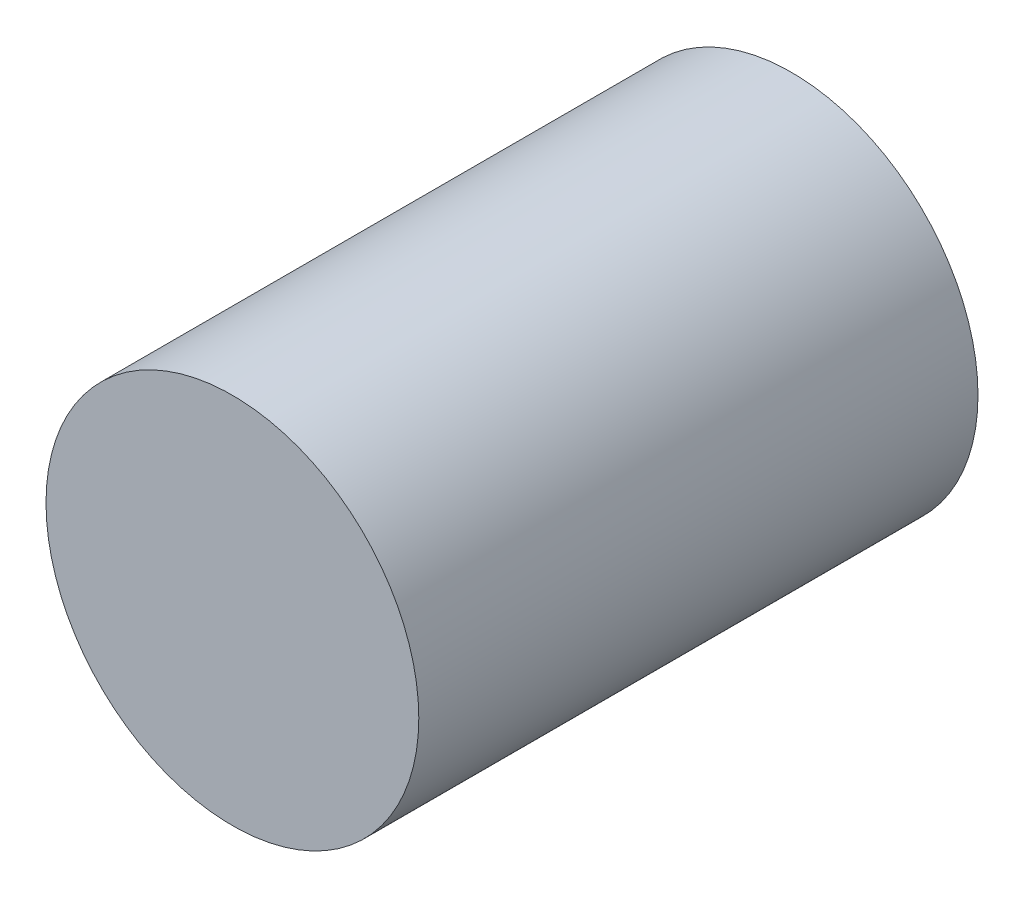
ISO-10303-21;
HEADER;
FILE_DESCRIPTION(('STEP AP214'),'2;1');
FILE_NAME('part.step','',(''),(''),'','','');
FILE_SCHEMA(('AUTOMOTIVE_DESIGN { 1 0 10303 214 1 1 1 1 }'));
ENDSEC;
DATA;
#1=APPLICATION_CONTEXT('core data for automotive mechanical design processes');
#2=APPLICATION_PROTOCOL_DEFINITION('international standard','automotive_design',2000,#1);
#3=PRODUCT_CONTEXT('',#1,'mechanical');
#4=PRODUCT('Part','Part','',(#3));
#5=PRODUCT_RELATED_PRODUCT_CATEGORY('part','',(#4));
#6=PRODUCT_DEFINITION_FORMATION('','',#4);
#7=PRODUCT_DEFINITION_CONTEXT('part definition',#1,'design');
#8=PRODUCT_DEFINITION('design','',#6,#7);
#9=PRODUCT_DEFINITION_SHAPE('','',#8);
#10=(LENGTH_UNIT() NAMED_UNIT(*) SI_UNIT(.MILLI.,.METRE.));
#11=(NAMED_UNIT(*) PLANE_ANGLE_UNIT() SI_UNIT($,.RADIAN.));
#12=(NAMED_UNIT(*) SI_UNIT($,.STERADIAN.) SOLID_ANGLE_UNIT());
#13=UNCERTAINTY_MEASURE_WITH_UNIT(LENGTH_MEASURE(1.E-05),#10,'distance_accuracy_value','');
#14=(GEOMETRIC_REPRESENTATION_CONTEXT(3) GLOBAL_UNCERTAINTY_ASSIGNED_CONTEXT((#13)) GLOBAL_UNIT_ASSIGNED_CONTEXT((#10,
#11,#12)) REPRESENTATION_CONTEXT('',''));
#15=CARTESIAN_POINT('',(0.,0.,0.));
#16=DIRECTION('',(0.,0.,1.));
#17=DIRECTION('',(1.,0.,0.));
#18=AXIS2_PLACEMENT_3D('',#15,#16,#17);
#19=CARTESIAN_POINT('',(0.,0.,30.));
#20=DIRECTION('',(0.,0.,-1.));
#21=DIRECTION('',(-1.,0.,0.));
#22=AXIS2_PLACEMENT_3D('',#19,#20,#21);
#23=CYLINDRICAL_SURFACE('',#22,10.);
#24=CARTESIAN_POINT('',(0.,0.,30.));
#25=DIRECTION('',(0.,0.,1.));
#26=DIRECTION('',(1.,0.,0.));
#27=AXIS2_PLACEMENT_3D('',#24,#25,#26);
#28=CIRCLE('',#27,10.);
#29=CARTESIAN_POINT('',(10.,0.,30.));
#30=VERTEX_POINT('',#29);
#31=EDGE_CURVE('E10',#30,#30,#28,.T.);
#32=ORIENTED_EDGE('',*,*,#31,.F.);
#33=EDGE_LOOP('',(#32));
#34=FACE_BOUND('',#33,.T.);
#35=CARTESIAN_POINT('',(0.,0.,0.));
#36=DIRECTION('',(0.,0.,1.));
#37=DIRECTION('',(1.,0.,0.));
#38=AXIS2_PLACEMENT_3D('',#35,#36,#37);
#39=CIRCLE('',#38,10.);
#40=CARTESIAN_POINT('',(10.,0.,0.));
#41=VERTEX_POINT('',#40);
#42=EDGE_CURVE('E40',#41,#41,#39,.T.);
#43=ORIENTED_EDGE('',*,*,#42,.T.);
#44=EDGE_LOOP('',(#43));
#45=FACE_BOUND('',#44,.T.);
#46=ADVANCED_FACE('F37',(#34,#45),#23,.T.);
#47=CARTESIAN_POINT('',(0.,0.,30.));
#48=DIRECTION('',(0.,0.,1.));
#49=DIRECTION('',(1.,0.,0.));
#50=AXIS2_PLACEMENT_3D('',#47,#48,#49);
#51=PLANE('',#50);
#52=ORIENTED_EDGE('',*,*,#31,.T.);
#53=EDGE_LOOP('',(#52));
#54=FACE_BOUND('',#53,.T.);
#55=ADVANCED_FACE('F52',(#54),#51,.T.);
#56=CARTESIAN_POINT('',(0.,0.,0.));
#57=DIRECTION('',(0.,0.,1.));
#58=DIRECTION('',(1.,0.,0.));
#59=AXIS2_PLACEMENT_3D('',#56,#57,#58);
#60=PLANE('',#59);
#61=ORIENTED_EDGE('',*,*,#42,.F.);
#62=EDGE_LOOP('',(#61));
#63=FACE_BOUND('',#62,.T.);
#64=ADVANCED_FACE('F50',(#63),#60,.F.);
#65=CLOSED_SHELL('',(#46,#55,#64));
#66=MANIFOLD_SOLID_BREP('B2',#65);
#67=ADVANCED_BREP_SHAPE_REPRESENTATION('',(#18,#66),#14);
#68=SHAPE_DEFINITION_REPRESENTATION(#9,#67);
ENDSEC;
END-ISO-10303-21;
